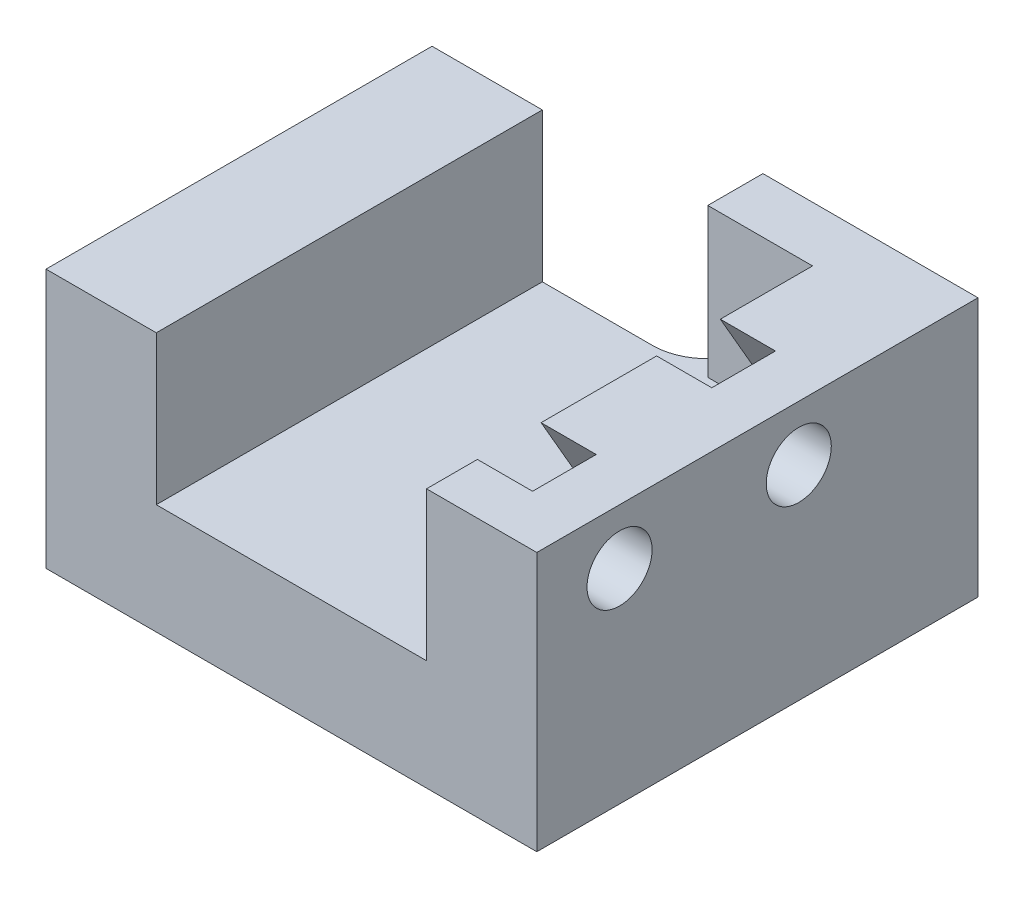
ISO-10303-21;
HEADER;
FILE_DESCRIPTION(('STEP AP214'),'2;1');
FILE_NAME('part.step','',(''),(''),'','','');
FILE_SCHEMA(('AUTOMOTIVE_DESIGN { 1 0 10303 214 1 1 1 1 }'));
ENDSEC;
DATA;
#1=APPLICATION_CONTEXT('core data for automotive mechanical design processes');
#2=APPLICATION_PROTOCOL_DEFINITION('international standard','automotive_design',2000,#1);
#3=PRODUCT_CONTEXT('',#1,'mechanical');
#4=PRODUCT('Part','Part','',(#3));
#5=PRODUCT_RELATED_PRODUCT_CATEGORY('part','',(#4));
#6=PRODUCT_DEFINITION_FORMATION('','',#4);
#7=PRODUCT_DEFINITION_CONTEXT('part definition',#1,'design');
#8=PRODUCT_DEFINITION('design','',#6,#7);
#9=PRODUCT_DEFINITION_SHAPE('','',#8);
#10=(LENGTH_UNIT() NAMED_UNIT(*) SI_UNIT(.MILLI.,.METRE.));
#11=(NAMED_UNIT(*) PLANE_ANGLE_UNIT() SI_UNIT($,.RADIAN.));
#12=(NAMED_UNIT(*) SI_UNIT($,.STERADIAN.) SOLID_ANGLE_UNIT());
#13=UNCERTAINTY_MEASURE_WITH_UNIT(LENGTH_MEASURE(1.E-05),#10,'distance_accuracy_value','');
#14=(GEOMETRIC_REPRESENTATION_CONTEXT(3) GLOBAL_UNCERTAINTY_ASSIGNED_CONTEXT((#13)) GLOBAL_UNIT_ASSIGNED_CONTEXT((#10,
#11,#12)) REPRESENTATION_CONTEXT('',''));
#15=CARTESIAN_POINT('',(0.,0.,0.));
#16=DIRECTION('',(0.,0.,1.));
#17=DIRECTION('',(1.,0.,0.));
#18=AXIS2_PLACEMENT_3D('',#15,#16,#17);
#19=CARTESIAN_POINT('',(2.075,2.,-3.5));
#20=DIRECTION('',(0.,0.,1.));
#21=DIRECTION('',(1.,0.,0.));
#22=AXIS2_PLACEMENT_3D('',#19,#20,#21);
#23=PLANE('',#22);
#24=DIRECTION('',(-1.,0.,0.));
#25=VECTOR('',#24,1.);
#26=CARTESIAN_POINT('',(-2.075,2.,-3.5));
#27=LINE('',#26,#25);
#28=CARTESIAN_POINT('',(-0.0750000000000013,2.,-3.5));
#29=VERTEX_POINT('',#28);
#30=CARTESIAN_POINT('',(-2.075,2.,-3.5));
#31=VERTEX_POINT('',#30);
#32=EDGE_CURVE('E377',#29,#31,#27,.T.);
#33=ORIENTED_EDGE('',*,*,#32,.F.);
#34=DIRECTION('',(0.,1.,0.));
#35=VECTOR('',#34,1.);
#36=CARTESIAN_POINT('',(-0.0750000000000014,0.,-3.5));
#37=LINE('',#36,#35);
#38=CARTESIAN_POINT('',(-0.0750000000000004,0.,-3.5));
#39=VERTEX_POINT('',#38);
#40=EDGE_CURVE('E60',#29,#39,#37,.F.);
#41=ORIENTED_EDGE('',*,*,#40,.T.);
#42=DIRECTION('',(-1.,0.,0.));
#43=VECTOR('',#42,1.);
#44=CARTESIAN_POINT('',(2.075,0.,-3.5));
#45=LINE('',#44,#43);
#46=CARTESIAN_POINT('',(-4.075,0.,-3.5));
#47=VERTEX_POINT('',#46);
#48=EDGE_CURVE('E204',#39,#47,#45,.T.);
#49=ORIENTED_EDGE('',*,*,#48,.T.);
#50=DIRECTION('',(0.,-1.,0.));
#51=VECTOR('',#50,1.);
#52=CARTESIAN_POINT('',(-4.075,2.,-3.5));
#53=LINE('',#52,#51);
#54=CARTESIAN_POINT('',(-4.075,4.7,-3.5));
#55=VERTEX_POINT('',#54);
#56=EDGE_CURVE('E387',#55,#47,#53,.T.);
#57=ORIENTED_EDGE('',*,*,#56,.F.);
#58=DIRECTION('',(-1.,0.,0.));
#59=VECTOR('',#58,1.);
#60=CARTESIAN_POINT('',(-4.075,4.7,-3.5));
#61=LINE('',#60,#59);
#62=CARTESIAN_POINT('',(-2.075,4.7,-3.5));
#63=VERTEX_POINT('',#62);
#64=EDGE_CURVE('E361',#63,#55,#61,.T.);
#65=ORIENTED_EDGE('',*,*,#64,.F.);
#66=DIRECTION('',(0.,-1.,0.));
#67=VECTOR('',#66,1.);
#68=CARTESIAN_POINT('',(-2.075,4.7,-3.5));
#69=LINE('',#68,#67);
#70=EDGE_CURVE('E364',#63,#31,#69,.T.);
#71=ORIENTED_EDGE('',*,*,#70,.T.);
#72=EDGE_LOOP('',(#33,#41,#49,#57,#65,#71));
#73=FACE_BOUND('',#72,.T.);
#74=ADVANCED_FACE('F39',(#73),#23,.F.);
#75=CARTESIAN_POINT('',(0.,2.,0.));
#76=DIRECTION('',(0.,1.,0.));
#77=DIRECTION('',(0.,0.,1.));
#78=AXIS2_PLACEMENT_3D('',#75,#76,#77);
#79=PLANE('',#78);
#80=DIRECTION('',(1.,0.,0.));
#81=VECTOR('',#80,1.);
#82=CARTESIAN_POINT('',(-4.075,2.,3.5));
#83=LINE('',#82,#81);
#84=CARTESIAN_POINT('',(-2.075,2.,3.5));
#85=VERTEX_POINT('',#84);
#86=CARTESIAN_POINT('',(2.825,2.,3.5));
#87=VERTEX_POINT('',#86);
#88=EDGE_CURVE('E376',#85,#87,#83,.T.);
#89=ORIENTED_EDGE('',*,*,#88,.T.);
#90=DIRECTION('',(0.,0.,1.));
#91=VECTOR('',#90,1.);
#92=CARTESIAN_POINT('',(2.825,2.,-3.5));
#93=LINE('',#92,#91);
#94=CARTESIAN_POINT('',(2.825,2.,-3.5));
#95=VERTEX_POINT('',#94);
#96=EDGE_CURVE('E341',#95,#87,#93,.T.);
#97=ORIENTED_EDGE('',*,*,#96,.F.);
#98=CARTESIAN_POINT('',(0.924999999999999,2.,-3.5));
#99=VERTEX_POINT('',#98);
#100=EDGE_CURVE('E373',#95,#99,#27,.T.);
#101=ORIENTED_EDGE('',*,*,#100,.T.);
#102=DIRECTION('',(0.,0.,1.));
#103=VECTOR('',#102,1.);
#104=CARTESIAN_POINT('',(0.924999999999999,2.,-4.5));
#105=LINE('',#104,#103);
#106=CARTESIAN_POINT('',(0.924999999999999,2.,-4.5));
#107=VERTEX_POINT('',#106);
#108=EDGE_CURVE('E390',#107,#99,#105,.T.);
#109=ORIENTED_EDGE('',*,*,#108,.F.);
#110=CARTESIAN_POINT('',(-0.0750000000000012,2.,-4.5));
#111=DIRECTION('',(0.,1.,0.));
#112=DIRECTION('',(0.,0.,1.));
#113=AXIS2_PLACEMENT_3D('',#110,#111,#112);
#114=CIRCLE('',#113,1.);
#115=EDGE_CURVE('E47',#107,#29,#114,.F.);
#116=ORIENTED_EDGE('',*,*,#115,.T.);
#117=ORIENTED_EDGE('',*,*,#32,.T.);
#118=DIRECTION('',(0.,0.,-1.));
#119=VECTOR('',#118,1.);
#120=CARTESIAN_POINT('',(-2.075,2.,-3.5));
#121=LINE('',#120,#119);
#122=EDGE_CURVE('E344',#85,#31,#121,.T.);
#123=ORIENTED_EDGE('',*,*,#122,.F.);
#124=EDGE_LOOP('',(#89,#97,#101,#109,#116,#117,#123));
#125=FACE_BOUND('',#124,.T.);
#126=ADVANCED_FACE('F398',(#125),#79,.T.);
#127=CARTESIAN_POINT('',(-4.075,2.,-3.5));
#128=DIRECTION('',(1.,0.,0.));
#129=DIRECTION('',(0.,0.,-1.));
#130=AXIS2_PLACEMENT_3D('',#127,#128,#129);
#131=PLANE('',#130);
#132=DIRECTION('',(0.,0.,1.));
#133=VECTOR('',#132,1.);
#134=CARTESIAN_POINT('',(-4.075,0.,-3.5));
#135=LINE('',#134,#133);
#136=CARTESIAN_POINT('',(-4.075,0.,3.5));
#137=VERTEX_POINT('',#136);
#138=EDGE_CURVE('E372',#47,#137,#135,.T.);
#139=ORIENTED_EDGE('',*,*,#138,.T.);
#140=DIRECTION('',(0.,-1.,0.));
#141=VECTOR('',#140,1.);
#142=CARTESIAN_POINT('',(-4.075,2.,3.5));
#143=LINE('',#142,#141);
#144=CARTESIAN_POINT('',(-4.075,4.7,3.5));
#145=VERTEX_POINT('',#144);
#146=EDGE_CURVE('E384',#145,#137,#143,.T.);
#147=ORIENTED_EDGE('',*,*,#146,.F.);
#148=DIRECTION('',(0.,0.,1.));
#149=VECTOR('',#148,1.);
#150=CARTESIAN_POINT('',(-4.075,4.7,-3.5));
#151=LINE('',#150,#149);
#152=EDGE_CURVE('E354',#55,#145,#151,.T.);
#153=ORIENTED_EDGE('',*,*,#152,.F.);
#154=ORIENTED_EDGE('',*,*,#56,.T.);
#155=EDGE_LOOP('',(#139,#147,#153,#154));
#156=FACE_BOUND('',#155,.T.);
#157=ADVANCED_FACE('F470',(#156),#131,.F.);
#158=CARTESIAN_POINT('',(4.825,2.,3.5));
#159=DIRECTION('',(0.,0.,-1.));
#160=DIRECTION('',(-1.,0.,0.));
#161=AXIS2_PLACEMENT_3D('',#158,#159,#160);
#162=PLANE('',#161);
#163=DIRECTION('',(1.,0.,0.));
#164=VECTOR('',#163,1.);
#165=CARTESIAN_POINT('',(4.825,0.,3.5));
#166=LINE('',#165,#164);
#167=CARTESIAN_POINT('',(4.825,0.,3.5));
#168=VERTEX_POINT('',#167);
#169=EDGE_CURVE('E205',#137,#168,#166,.T.);
#170=ORIENTED_EDGE('',*,*,#169,.T.);
#171=DIRECTION('',(0.,-1.,0.));
#172=VECTOR('',#171,1.);
#173=CARTESIAN_POINT('',(4.825,2.,3.5));
#174=LINE('',#173,#172);
#175=CARTESIAN_POINT('',(4.825,4.7,3.5));
#176=VERTEX_POINT('',#175);
#177=EDGE_CURVE('E202',#176,#168,#174,.T.);
#178=ORIENTED_EDGE('',*,*,#177,.F.);
#179=DIRECTION('',(1.,0.,0.));
#180=VECTOR('',#179,1.);
#181=CARTESIAN_POINT('',(2.825,4.7,3.5));
#182=LINE('',#181,#180);
#183=CARTESIAN_POINT('',(2.825,4.7,3.5));
#184=VERTEX_POINT('',#183);
#185=EDGE_CURVE('E347',#184,#176,#182,.T.);
#186=ORIENTED_EDGE('',*,*,#185,.F.);
#187=DIRECTION('',(0.,-1.,0.));
#188=VECTOR('',#187,1.);
#189=CARTESIAN_POINT('',(2.825,4.7,3.5));
#190=LINE('',#189,#188);
#191=EDGE_CURVE('E282',#184,#87,#190,.T.);
#192=ORIENTED_EDGE('',*,*,#191,.T.);
#193=ORIENTED_EDGE('',*,*,#88,.F.);
#194=DIRECTION('',(0.,-1.,0.));
#195=VECTOR('',#194,1.);
#196=CARTESIAN_POINT('',(-2.075,4.7,3.5));
#197=LINE('',#196,#195);
#198=CARTESIAN_POINT('',(-2.075,4.7,3.5));
#199=VERTEX_POINT('',#198);
#200=EDGE_CURVE('E369',#199,#85,#197,.T.);
#201=ORIENTED_EDGE('',*,*,#200,.F.);
#202=DIRECTION('',(1.,0.,0.));
#203=VECTOR('',#202,1.);
#204=CARTESIAN_POINT('',(-4.075,4.7,3.5));
#205=LINE('',#204,#203);
#206=EDGE_CURVE('E357',#145,#199,#205,.T.);
#207=ORIENTED_EDGE('',*,*,#206,.F.);
#208=ORIENTED_EDGE('',*,*,#146,.T.);
#209=EDGE_LOOP('',(#170,#178,#186,#192,#193,#201,#207,#208));
#210=FACE_BOUND('',#209,.T.);
#211=ADVANCED_FACE('F410',(#210),#162,.F.);
#212=CARTESIAN_POINT('',(4.825,2.,-3.5));
#213=DIRECTION('',(-1.,0.,0.));
#214=DIRECTION('',(0.,0.,1.));
#215=AXIS2_PLACEMENT_3D('',#212,#213,#214);
#216=PLANE('',#215);
#217=CARTESIAN_POINT('',(4.825,3.7,2.));
#218=DIRECTION('',(1.,0.,0.));
#219=DIRECTION('',(0.,0.,-1.));
#220=AXIS2_PLACEMENT_3D('',#217,#218,#219);
#221=CIRCLE('',#220,0.59);
#222=CARTESIAN_POINT('',(4.825,3.7,1.41));
#223=VERTEX_POINT('',#222);
#224=EDGE_CURVE('E239',#223,#223,#221,.T.);
#225=ORIENTED_EDGE('',*,*,#224,.F.);
#226=EDGE_LOOP('',(#225));
#227=FACE_BOUND('',#226,.T.);
#228=CARTESIAN_POINT('',(4.825,3.7,-1.25));
#229=DIRECTION('',(1.,0.,0.));
#230=DIRECTION('',(0.,0.,-1.));
#231=AXIS2_PLACEMENT_3D('',#228,#229,#230);
#232=CIRCLE('',#231,0.59);
#233=CARTESIAN_POINT('',(4.825,3.7,-1.84));
#234=VERTEX_POINT('',#233);
#235=EDGE_CURVE('E242',#234,#234,#232,.T.);
#236=ORIENTED_EDGE('',*,*,#235,.F.);
#237=EDGE_LOOP('',(#236));
#238=FACE_BOUND('',#237,.T.);
#239=DIRECTION('',(0.,0.,-1.));
#240=VECTOR('',#239,1.);
#241=CARTESIAN_POINT('',(4.825,0.,-3.5));
#242=LINE('',#241,#240);
#243=CARTESIAN_POINT('',(4.825,0.,-4.5));
#244=VERTEX_POINT('',#243);
#245=EDGE_CURVE('E196',#168,#244,#242,.T.);
#246=ORIENTED_EDGE('',*,*,#245,.T.);
#247=DIRECTION('',(0.,-1.,0.));
#248=VECTOR('',#247,1.);
#249=CARTESIAN_POINT('',(4.825,4.7,-4.5));
#250=LINE('',#249,#248);
#251=CARTESIAN_POINT('',(4.825,4.7,-4.5));
#252=VERTEX_POINT('',#251);
#253=EDGE_CURVE('E201',#252,#244,#250,.T.);
#254=ORIENTED_EDGE('',*,*,#253,.F.);
#255=DIRECTION('',(0.,0.,-1.));
#256=VECTOR('',#255,1.);
#257=CARTESIAN_POINT('',(4.825,4.7,-3.5));
#258=LINE('',#257,#256);
#259=EDGE_CURVE('E340',#176,#252,#258,.T.);
#260=ORIENTED_EDGE('',*,*,#259,.F.);
#261=ORIENTED_EDGE('',*,*,#177,.T.);
#262=EDGE_LOOP('',(#246,#254,#260,#261));
#263=FACE_BOUND('',#262,.T.);
#264=ADVANCED_FACE('F198',(#227,#238,#263),#216,.F.);
#265=CARTESIAN_POINT('',(0.,0.,0.));
#266=DIRECTION('',(0.,1.,0.));
#267=DIRECTION('',(0.,0.,1.));
#268=AXIS2_PLACEMENT_3D('',#265,#266,#267);
#269=PLANE('',#268);
#270=ORIENTED_EDGE('',*,*,#138,.F.);
#271=ORIENTED_EDGE('',*,*,#48,.F.);
#272=CARTESIAN_POINT('',(-0.0750000000000015,0.,-4.5));
#273=DIRECTION('',(0.,1.,0.));
#274=DIRECTION('',(0.,0.,1.));
#275=AXIS2_PLACEMENT_3D('',#272,#273,#274);
#276=CIRCLE('',#275,1.);
#277=CARTESIAN_POINT('',(0.924999999999998,0.,-4.5));
#278=VERTEX_POINT('',#277);
#279=EDGE_CURVE('E11',#39,#278,#276,.T.);
#280=ORIENTED_EDGE('',*,*,#279,.T.);
#281=DIRECTION('',(-1.,0.,0.));
#282=VECTOR('',#281,1.);
#283=CARTESIAN_POINT('',(4.825,0.,-4.5));
#284=LINE('',#283,#282);
#285=EDGE_CURVE('E208',#244,#278,#284,.T.);
#286=ORIENTED_EDGE('',*,*,#285,.F.);
#287=ORIENTED_EDGE('',*,*,#245,.F.);
#288=ORIENTED_EDGE('',*,*,#169,.F.);
#289=EDGE_LOOP('',(#270,#271,#280,#286,#287,#288));
#290=FACE_BOUND('',#289,.T.);
#291=ADVANCED_FACE('F210',(#290),#269,.F.);
#292=CARTESIAN_POINT('',(-2.075,4.7,-3.5));
#293=DIRECTION('',(-1.,0.,0.));
#294=DIRECTION('',(0.,0.,1.));
#295=AXIS2_PLACEMENT_3D('',#292,#293,#294);
#296=PLANE('',#295);
#297=ORIENTED_EDGE('',*,*,#122,.T.);
#298=ORIENTED_EDGE('',*,*,#70,.F.);
#299=DIRECTION('',(0.,0.,-1.));
#300=VECTOR('',#299,1.);
#301=CARTESIAN_POINT('',(-2.075,4.7,-3.5));
#302=LINE('',#301,#300);
#303=EDGE_CURVE('E359',#199,#63,#302,.T.);
#304=ORIENTED_EDGE('',*,*,#303,.F.);
#305=ORIENTED_EDGE('',*,*,#200,.T.);
#306=EDGE_LOOP('',(#297,#298,#304,#305));
#307=FACE_BOUND('',#306,.T.);
#308=ADVANCED_FACE('F546',(#307),#296,.F.);
#309=CARTESIAN_POINT('',(0.,4.7,0.));
#310=DIRECTION('',(0.,1.,0.));
#311=DIRECTION('',(0.,0.,1.));
#312=AXIS2_PLACEMENT_3D('',#309,#310,#311);
#313=PLANE('',#312);
#314=ORIENTED_EDGE('',*,*,#152,.T.);
#315=ORIENTED_EDGE('',*,*,#206,.T.);
#316=ORIENTED_EDGE('',*,*,#303,.T.);
#317=ORIENTED_EDGE('',*,*,#64,.T.);
#318=EDGE_LOOP('',(#314,#315,#316,#317));
#319=FACE_BOUND('',#318,.T.);
#320=ADVANCED_FACE('F487',(#319),#313,.T.);
#321=CARTESIAN_POINT('',(2.825,4.7,-3.5));
#322=DIRECTION('',(1.,0.,0.));
#323=DIRECTION('',(0.,0.,-1.));
#324=AXIS2_PLACEMENT_3D('',#321,#322,#323);
#325=PLANE('',#324);
#326=DIRECTION('',(0.,-0.866025403784439,0.5));
#327=VECTOR('',#326,1.);
#328=CARTESIAN_POINT('',(2.825,3.7,-2.40470053837925));
#329=LINE('',#328,#327);
#330=CARTESIAN_POINT('',(2.825,3.7,-2.40470053837925));
#331=VERTEX_POINT('',#330);
#332=CARTESIAN_POINT('',(2.825,2.7,-1.82735026918963));
#333=VERTEX_POINT('',#332);
#334=EDGE_CURVE('E275',#331,#333,#329,.T.);
#335=ORIENTED_EDGE('',*,*,#334,.F.);
#336=DIRECTION('',(0.,-0.866025403784439,-0.5));
#337=VECTOR('',#336,1.);
#338=CARTESIAN_POINT('',(2.825,4.7,-1.82735026918963));
#339=LINE('',#338,#337);
#340=CARTESIAN_POINT('',(2.825,4.7,-1.82735026918963));
#341=VERTEX_POINT('',#340);
#342=EDGE_CURVE('E272',#341,#331,#339,.T.);
#343=ORIENTED_EDGE('',*,*,#342,.F.);
#344=DIRECTION('',(0.,0.,1.));
#345=VECTOR('',#344,1.);
#346=CARTESIAN_POINT('',(2.825,4.7,-3.5));
#347=LINE('',#346,#345);
#348=CARTESIAN_POINT('',(2.825,4.7,-3.5));
#349=VERTEX_POINT('',#348);
#350=EDGE_CURVE('E345',#349,#341,#347,.T.);
#351=ORIENTED_EDGE('',*,*,#350,.F.);
#352=DIRECTION('',(0.,-1.,0.));
#353=VECTOR('',#352,1.);
#354=CARTESIAN_POINT('',(2.825,4.7,-3.5));
#355=LINE('',#354,#353);
#356=EDGE_CURVE('E337',#349,#95,#355,.T.);
#357=ORIENTED_EDGE('',*,*,#356,.T.);
#358=ORIENTED_EDGE('',*,*,#96,.T.);
#359=ORIENTED_EDGE('',*,*,#191,.F.);
#360=CARTESIAN_POINT('',(2.825,4.7,2.57735026918963));
#361=VERTEX_POINT('',#360);
#362=EDGE_CURVE('E350',#361,#184,#347,.T.);
#363=ORIENTED_EDGE('',*,*,#362,.F.);
#364=DIRECTION('',(0.,0.866025403784439,-0.499999999999999));
#365=VECTOR('',#364,1.);
#366=CARTESIAN_POINT('',(2.825,3.7,3.15470053837925));
#367=LINE('',#366,#365);
#368=CARTESIAN_POINT('',(2.825,3.7,3.15470053837925));
#369=VERTEX_POINT('',#368);
#370=EDGE_CURVE('E316',#369,#361,#367,.T.);
#371=ORIENTED_EDGE('',*,*,#370,.F.);
#372=DIRECTION('',(0.,0.866025403784439,0.5));
#373=VECTOR('',#372,1.);
#374=CARTESIAN_POINT('',(2.825,2.7,2.57735026918963));
#375=LINE('',#374,#373);
#376=CARTESIAN_POINT('',(2.825,2.7,2.57735026918963));
#377=VERTEX_POINT('',#376);
#378=EDGE_CURVE('E270',#377,#369,#375,.T.);
#379=ORIENTED_EDGE('',*,*,#378,.F.);
#380=DIRECTION('',(0.,0.,1.));
#381=VECTOR('',#380,1.);
#382=CARTESIAN_POINT('',(2.825,2.7,1.42264973081037));
#383=LINE('',#382,#381);
#384=CARTESIAN_POINT('',(2.825,2.7,1.42264973081037));
#385=VERTEX_POINT('',#384);
#386=EDGE_CURVE('E306',#385,#377,#383,.T.);
#387=ORIENTED_EDGE('',*,*,#386,.F.);
#388=DIRECTION('',(0.,-0.866025403784439,0.5));
#389=VECTOR('',#388,1.);
#390=CARTESIAN_POINT('',(2.825,3.7,0.845299461620749));
#391=LINE('',#390,#389);
#392=CARTESIAN_POINT('',(2.825,3.7,0.845299461620749));
#393=VERTEX_POINT('',#392);
#394=EDGE_CURVE('E309',#393,#385,#391,.T.);
#395=ORIENTED_EDGE('',*,*,#394,.F.);
#396=DIRECTION('',(0.,-0.866025403784439,-0.5));
#397=VECTOR('',#396,1.);
#398=CARTESIAN_POINT('',(2.825,4.7,1.42264973081037));
#399=LINE('',#398,#397);
#400=CARTESIAN_POINT('',(2.825,4.7,1.42264973081037));
#401=VERTEX_POINT('',#400);
#402=EDGE_CURVE('E313',#401,#393,#399,.T.);
#403=ORIENTED_EDGE('',*,*,#402,.F.);
#404=CARTESIAN_POINT('',(2.825,4.7,-0.672649730810375));
#405=VERTEX_POINT('',#404);
#406=EDGE_CURVE('E353',#405,#401,#347,.T.);
#407=ORIENTED_EDGE('',*,*,#406,.F.);
#408=DIRECTION('',(0.,0.866025403784439,-0.5));
#409=VECTOR('',#408,1.);
#410=CARTESIAN_POINT('',(2.825,3.7,-0.095299461620748));
#411=LINE('',#410,#409);
#412=CARTESIAN_POINT('',(2.825,3.7,-0.095299461620748));
#413=VERTEX_POINT('',#412);
#414=EDGE_CURVE('E269',#413,#405,#411,.T.);
#415=ORIENTED_EDGE('',*,*,#414,.F.);
#416=DIRECTION('',(0.,0.866025403784439,0.5));
#417=VECTOR('',#416,1.);
#418=CARTESIAN_POINT('',(2.825,2.7,-0.672649730810375));
#419=LINE('',#418,#417);
#420=CARTESIAN_POINT('',(2.825,2.7,-0.672649730810375));
#421=VERTEX_POINT('',#420);
#422=EDGE_CURVE('E266',#421,#413,#419,.T.);
#423=ORIENTED_EDGE('',*,*,#422,.F.);
#424=DIRECTION('',(0.,0.,1.));
#425=VECTOR('',#424,1.);
#426=CARTESIAN_POINT('',(2.825,2.7,-1.82735026918963));
#427=LINE('',#426,#425);
#428=EDGE_CURVE('E251',#333,#421,#427,.T.);
#429=ORIENTED_EDGE('',*,*,#428,.F.);
#430=EDGE_LOOP('',(#335,#343,#351,#357,#358,#359,#363,#371,#379,#387,#395,#403,#407,#415,#423,#429));
#431=FACE_BOUND('',#430,.T.);
#432=ADVANCED_FACE('F414',(#431),#325,.F.);
#433=CARTESIAN_POINT('',(0.,4.7,0.));
#434=DIRECTION('',(0.,1.,0.));
#435=DIRECTION('',(0.,0.,1.));
#436=AXIS2_PLACEMENT_3D('',#433,#434,#435);
#437=PLANE('',#436);
#438=DIRECTION('',(-1.,0.,0.));
#439=VECTOR('',#438,1.);
#440=CARTESIAN_POINT('',(3.825,4.7,-1.82735026918963));
#441=LINE('',#440,#439);
#442=CARTESIAN_POINT('',(3.825,4.7,-1.82735026918963));
#443=VERTEX_POINT('',#442);
#444=EDGE_CURVE('E287',#443,#341,#441,.T.);
#445=ORIENTED_EDGE('',*,*,#444,.F.);
#446=DIRECTION('',(0.,0.,-1.));
#447=VECTOR('',#446,1.);
#448=CARTESIAN_POINT('',(3.825,4.7,-0.672649730810375));
#449=LINE('',#448,#447);
#450=CARTESIAN_POINT('',(3.825,4.7,-0.672649730810375));
#451=VERTEX_POINT('',#450);
#452=EDGE_CURVE('E253',#451,#443,#449,.T.);
#453=ORIENTED_EDGE('',*,*,#452,.F.);
#454=DIRECTION('',(-1.,0.,0.));
#455=VECTOR('',#454,1.);
#456=CARTESIAN_POINT('',(3.825,4.7,-0.672649730810375));
#457=LINE('',#456,#455);
#458=EDGE_CURVE('E289',#451,#405,#457,.T.);
#459=ORIENTED_EDGE('',*,*,#458,.T.);
#460=ORIENTED_EDGE('',*,*,#406,.T.);
#461=DIRECTION('',(-1.,0.,0.));
#462=VECTOR('',#461,1.);
#463=CARTESIAN_POINT('',(3.825,4.7,1.42264973081037));
#464=LINE('',#463,#462);
#465=CARTESIAN_POINT('',(3.825,4.7,1.42264973081037));
#466=VERTEX_POINT('',#465);
#467=EDGE_CURVE('E299',#466,#401,#464,.T.);
#468=ORIENTED_EDGE('',*,*,#467,.F.);
#469=DIRECTION('',(0.,0.,-1.));
#470=VECTOR('',#469,1.);
#471=CARTESIAN_POINT('',(3.825,4.7,2.57735026918963));
#472=LINE('',#471,#470);
#473=CARTESIAN_POINT('',(3.825,4.7,2.57735026918963));
#474=VERTEX_POINT('',#473);
#475=EDGE_CURVE('E328',#474,#466,#472,.T.);
#476=ORIENTED_EDGE('',*,*,#475,.F.);
#477=DIRECTION('',(-1.,0.,0.));
#478=VECTOR('',#477,1.);
#479=CARTESIAN_POINT('',(3.825,4.7,2.57735026918963));
#480=LINE('',#479,#478);
#481=EDGE_CURVE('E296',#474,#361,#480,.T.);
#482=ORIENTED_EDGE('',*,*,#481,.T.);
#483=ORIENTED_EDGE('',*,*,#362,.T.);
#484=ORIENTED_EDGE('',*,*,#185,.T.);
#485=ORIENTED_EDGE('',*,*,#259,.T.);
#486=DIRECTION('',(1.,0.,0.));
#487=VECTOR('',#486,1.);
#488=CARTESIAN_POINT('',(4.825,4.7,-4.5));
#489=LINE('',#488,#487);
#490=CARTESIAN_POINT('',(0.924999999999999,4.7,-4.5));
#491=VERTEX_POINT('',#490);
#492=EDGE_CURVE('E220',#491,#252,#489,.T.);
#493=ORIENTED_EDGE('',*,*,#492,.F.);
#494=DIRECTION('',(0.,0.,1.));
#495=VECTOR('',#494,1.);
#496=CARTESIAN_POINT('',(0.924999999999999,4.7,-4.5));
#497=LINE('',#496,#495);
#498=CARTESIAN_POINT('',(0.924999999999999,4.7,-3.5));
#499=VERTEX_POINT('',#498);
#500=EDGE_CURVE('E230',#491,#499,#497,.T.);
#501=ORIENTED_EDGE('',*,*,#500,.T.);
#502=DIRECTION('',(1.,0.,0.));
#503=VECTOR('',#502,1.);
#504=CARTESIAN_POINT('',(4.825,4.7,-3.5));
#505=LINE('',#504,#503);
#506=EDGE_CURVE('E221',#499,#349,#505,.T.);
#507=ORIENTED_EDGE('',*,*,#506,.T.);
#508=ORIENTED_EDGE('',*,*,#350,.T.);
#509=EDGE_LOOP('',(#445,#453,#459,#460,#468,#476,#482,#483,#484,#485,#493,#501,#507,#508));
#510=FACE_BOUND('',#509,.T.);
#511=ADVANCED_FACE('F405',(#510),#437,.T.);
#512=CARTESIAN_POINT('',(3.825,2.7,2.57735026918963));
#513=DIRECTION('',(0.,-0.5,0.866025403784439));
#514=DIRECTION('',(0.,-0.866025403784439,-0.5));
#515=AXIS2_PLACEMENT_3D('',#512,#513,#514);
#516=PLANE('',#515);
#517=ORIENTED_EDGE('',*,*,#378,.T.);
#518=DIRECTION('',(-1.,0.,0.));
#519=VECTOR('',#518,1.);
#520=CARTESIAN_POINT('',(3.825,3.7,3.15470053837925));
#521=LINE('',#520,#519);
#522=CARTESIAN_POINT('',(3.825,3.7,3.15470053837925));
#523=VERTEX_POINT('',#522);
#524=EDGE_CURVE('E293',#523,#369,#521,.T.);
#525=ORIENTED_EDGE('',*,*,#524,.F.);
#526=DIRECTION('',(0.,0.866025403784439,0.5));
#527=VECTOR('',#526,1.);
#528=CARTESIAN_POINT('',(3.825,2.7,2.57735026918963));
#529=LINE('',#528,#527);
#530=CARTESIAN_POINT('',(3.825,2.7,2.57735026918963));
#531=VERTEX_POINT('',#530);
#532=EDGE_CURVE('E310',#531,#523,#529,.T.);
#533=ORIENTED_EDGE('',*,*,#532,.F.);
#534=DIRECTION('',(-1.,0.,0.));
#535=VECTOR('',#534,1.);
#536=CARTESIAN_POINT('',(3.825,2.7,2.57735026918963));
#537=LINE('',#536,#535);
#538=EDGE_CURVE('E238',#531,#377,#537,.T.);
#539=ORIENTED_EDGE('',*,*,#538,.T.);
#540=EDGE_LOOP('',(#517,#525,#533,#539));
#541=FACE_BOUND('',#540,.T.);
#542=ADVANCED_FACE('F450',(#541),#516,.F.);
#543=CARTESIAN_POINT('',(3.825,2.7,1.42264973081037));
#544=DIRECTION('',(0.,-1.,0.));
#545=DIRECTION('',(0.,0.,-1.));
#546=AXIS2_PLACEMENT_3D('',#543,#544,#545);
#547=PLANE('',#546);
#548=ORIENTED_EDGE('',*,*,#386,.T.);
#549=ORIENTED_EDGE('',*,*,#538,.F.);
#550=DIRECTION('',(0.,0.,1.));
#551=VECTOR('',#550,1.);
#552=CARTESIAN_POINT('',(3.825,2.7,1.42264973081037));
#553=LINE('',#552,#551);
#554=CARTESIAN_POINT('',(3.825,2.7,1.42264973081037));
#555=VERTEX_POINT('',#554);
#556=EDGE_CURVE('E295',#555,#531,#553,.T.);
#557=ORIENTED_EDGE('',*,*,#556,.F.);
#558=DIRECTION('',(-1.,0.,0.));
#559=VECTOR('',#558,1.);
#560=CARTESIAN_POINT('',(3.825,2.7,1.42264973081037));
#561=LINE('',#560,#559);
#562=EDGE_CURVE('E303',#555,#385,#561,.T.);
#563=ORIENTED_EDGE('',*,*,#562,.T.);
#564=EDGE_LOOP('',(#548,#549,#557,#563));
#565=FACE_BOUND('',#564,.T.);
#566=ADVANCED_FACE('F453',(#565),#547,.F.);
#567=CARTESIAN_POINT('',(3.825,3.7,0.845299461620749));
#568=DIRECTION('',(0.,-0.5,-0.866025403784439));
#569=DIRECTION('',(0.,0.866025403784439,-0.5));
#570=AXIS2_PLACEMENT_3D('',#567,#568,#569);
#571=PLANE('',#570);
#572=ORIENTED_EDGE('',*,*,#394,.T.);
#573=ORIENTED_EDGE('',*,*,#562,.F.);
#574=DIRECTION('',(0.,-0.866025403784439,0.5));
#575=VECTOR('',#574,1.);
#576=CARTESIAN_POINT('',(3.825,3.7,0.845299461620749));
#577=LINE('',#576,#575);
#578=CARTESIAN_POINT('',(3.825,3.7,0.845299461620749));
#579=VERTEX_POINT('',#578);
#580=EDGE_CURVE('E322',#579,#555,#577,.T.);
#581=ORIENTED_EDGE('',*,*,#580,.F.);
#582=DIRECTION('',(-1.,0.,0.));
#583=VECTOR('',#582,1.);
#584=CARTESIAN_POINT('',(3.825,3.7,0.845299461620749));
#585=LINE('',#584,#583);
#586=EDGE_CURVE('E301',#579,#393,#585,.T.);
#587=ORIENTED_EDGE('',*,*,#586,.T.);
#588=EDGE_LOOP('',(#572,#573,#581,#587));
#589=FACE_BOUND('',#588,.T.);
#590=ADVANCED_FACE('F455',(#589),#571,.F.);
#591=CARTESIAN_POINT('',(3.825,4.7,1.42264973081037));
#592=DIRECTION('',(0.,0.5,-0.866025403784439));
#593=DIRECTION('',(0.,0.866025403784439,0.5));
#594=AXIS2_PLACEMENT_3D('',#591,#592,#593);
#595=PLANE('',#594);
#596=ORIENTED_EDGE('',*,*,#402,.T.);
#597=ORIENTED_EDGE('',*,*,#586,.F.);
#598=DIRECTION('',(0.,-0.866025403784439,-0.5));
#599=VECTOR('',#598,1.);
#600=CARTESIAN_POINT('',(3.825,4.7,1.42264973081037));
#601=LINE('',#600,#599);
#602=EDGE_CURVE('E325',#466,#579,#601,.T.);
#603=ORIENTED_EDGE('',*,*,#602,.F.);
#604=ORIENTED_EDGE('',*,*,#467,.T.);
#605=EDGE_LOOP('',(#596,#597,#603,#604));
#606=FACE_BOUND('',#605,.T.);
#607=ADVANCED_FACE('F438',(#606),#595,.F.);
#608=CARTESIAN_POINT('',(3.825,3.7,3.15470053837925));
#609=DIRECTION('',(0.,0.499999999999999,0.866025403784439));
#610=DIRECTION('',(0.,-0.866025403784439,0.499999999999999));
#611=AXIS2_PLACEMENT_3D('',#608,#609,#610);
#612=PLANE('',#611);
#613=ORIENTED_EDGE('',*,*,#370,.T.);
#614=ORIENTED_EDGE('',*,*,#481,.F.);
#615=DIRECTION('',(0.,0.866025403784439,-0.499999999999999));
#616=VECTOR('',#615,1.);
#617=CARTESIAN_POINT('',(3.825,3.7,3.15470053837925));
#618=LINE('',#617,#616);
#619=EDGE_CURVE('E331',#523,#474,#618,.T.);
#620=ORIENTED_EDGE('',*,*,#619,.F.);
#621=ORIENTED_EDGE('',*,*,#524,.T.);
#622=EDGE_LOOP('',(#613,#614,#620,#621));
#623=FACE_BOUND('',#622,.T.);
#624=ADVANCED_FACE('F446',(#623),#612,.F.);
#625=CARTESIAN_POINT('',(3.825,0.,0.));
#626=DIRECTION('',(-1.,0.,0.));
#627=DIRECTION('',(0.,0.,1.));
#628=AXIS2_PLACEMENT_3D('',#625,#626,#627);
#629=PLANE('',#628);
#630=CARTESIAN_POINT('',(3.825,3.7,2.));
#631=DIRECTION('',(-1.,0.,0.));
#632=DIRECTION('',(0.,0.,1.));
#633=AXIS2_PLACEMENT_3D('',#630,#631,#632);
#634=CIRCLE('',#633,0.59);
#635=CARTESIAN_POINT('',(3.825,3.7,2.59));
#636=VERTEX_POINT('',#635);
#637=EDGE_CURVE('E235',#636,#636,#634,.F.);
#638=ORIENTED_EDGE('',*,*,#637,.T.);
#639=EDGE_LOOP('',(#638));
#640=FACE_BOUND('',#639,.T.);
#641=ORIENTED_EDGE('',*,*,#532,.T.);
#642=ORIENTED_EDGE('',*,*,#619,.T.);
#643=ORIENTED_EDGE('',*,*,#475,.T.);
#644=ORIENTED_EDGE('',*,*,#602,.T.);
#645=ORIENTED_EDGE('',*,*,#580,.T.);
#646=ORIENTED_EDGE('',*,*,#556,.T.);
#647=EDGE_LOOP('',(#641,#642,#643,#644,#645,#646));
#648=FACE_BOUND('',#647,.T.);
#649=ADVANCED_FACE('F441',(#640,#648),#629,.T.);
#650=CARTESIAN_POINT('',(3.825,2.7,-0.672649730810375));
#651=DIRECTION('',(0.,-0.5,0.866025403784439));
#652=DIRECTION('',(0.,-0.866025403784439,-0.5));
#653=AXIS2_PLACEMENT_3D('',#650,#651,#652);
#654=PLANE('',#653);
#655=ORIENTED_EDGE('',*,*,#422,.T.);
#656=DIRECTION('',(-1.,0.,0.));
#657=VECTOR('',#656,1.);
#658=CARTESIAN_POINT('',(3.825,3.7,-0.095299461620748));
#659=LINE('',#658,#657);
#660=CARTESIAN_POINT('',(3.825,3.7,-0.095299461620748));
#661=VERTEX_POINT('',#660);
#662=EDGE_CURVE('E265',#661,#413,#659,.T.);
#663=ORIENTED_EDGE('',*,*,#662,.F.);
#664=DIRECTION('',(0.,0.866025403784439,0.5));
#665=VECTOR('',#664,1.);
#666=CARTESIAN_POINT('',(3.825,2.7,-0.672649730810375));
#667=LINE('',#666,#665);
#668=CARTESIAN_POINT('',(3.825,2.7,-0.672649730810375));
#669=VERTEX_POINT('',#668);
#670=EDGE_CURVE('E247',#669,#661,#667,.T.);
#671=ORIENTED_EDGE('',*,*,#670,.F.);
#672=DIRECTION('',(-1.,0.,0.));
#673=VECTOR('',#672,1.);
#674=CARTESIAN_POINT('',(3.825,2.7,-0.672649730810375));
#675=LINE('',#674,#673);
#676=EDGE_CURVE('E280',#669,#421,#675,.T.);
#677=ORIENTED_EDGE('',*,*,#676,.T.);
#678=EDGE_LOOP('',(#655,#663,#671,#677));
#679=FACE_BOUND('',#678,.T.);
#680=ADVANCED_FACE('F518',(#679),#654,.F.);
#681=CARTESIAN_POINT('',(3.825,2.7,-1.82735026918963));
#682=DIRECTION('',(0.,-1.,0.));
#683=DIRECTION('',(0.,0.,-1.));
#684=AXIS2_PLACEMENT_3D('',#681,#682,#683);
#685=PLANE('',#684);
#686=ORIENTED_EDGE('',*,*,#428,.T.);
#687=ORIENTED_EDGE('',*,*,#676,.F.);
#688=DIRECTION('',(0.,0.,1.));
#689=VECTOR('',#688,1.);
#690=CARTESIAN_POINT('',(3.825,2.7,-1.82735026918963));
#691=LINE('',#690,#689);
#692=CARTESIAN_POINT('',(3.825,2.7,-1.82735026918963));
#693=VERTEX_POINT('',#692);
#694=EDGE_CURVE('E262',#693,#669,#691,.T.);
#695=ORIENTED_EDGE('',*,*,#694,.F.);
#696=DIRECTION('',(-1.,0.,0.));
#697=VECTOR('',#696,1.);
#698=CARTESIAN_POINT('',(3.825,2.7,-1.82735026918963));
#699=LINE('',#698,#697);
#700=EDGE_CURVE('E283',#693,#333,#699,.T.);
#701=ORIENTED_EDGE('',*,*,#700,.T.);
#702=EDGE_LOOP('',(#686,#687,#695,#701));
#703=FACE_BOUND('',#702,.T.);
#704=ADVANCED_FACE('F514',(#703),#685,.F.);
#705=CARTESIAN_POINT('',(3.825,3.7,-2.40470053837925));
#706=DIRECTION('',(0.,-0.5,-0.866025403784439));
#707=DIRECTION('',(0.,0.866025403784439,-0.5));
#708=AXIS2_PLACEMENT_3D('',#705,#706,#707);
#709=PLANE('',#708);
#710=ORIENTED_EDGE('',*,*,#334,.T.);
#711=ORIENTED_EDGE('',*,*,#700,.F.);
#712=DIRECTION('',(0.,-0.866025403784439,0.5));
#713=VECTOR('',#712,1.);
#714=CARTESIAN_POINT('',(3.825,3.7,-2.40470053837925));
#715=LINE('',#714,#713);
#716=CARTESIAN_POINT('',(3.825,3.7,-2.40470053837925));
#717=VERTEX_POINT('',#716);
#718=EDGE_CURVE('E259',#717,#693,#715,.T.);
#719=ORIENTED_EDGE('',*,*,#718,.F.);
#720=DIRECTION('',(-1.,0.,0.));
#721=VECTOR('',#720,1.);
#722=CARTESIAN_POINT('',(3.825,3.7,-2.40470053837925));
#723=LINE('',#722,#721);
#724=EDGE_CURVE('E285',#717,#331,#723,.T.);
#725=ORIENTED_EDGE('',*,*,#724,.T.);
#726=EDGE_LOOP('',(#710,#711,#719,#725));
#727=FACE_BOUND('',#726,.T.);
#728=ADVANCED_FACE('F517',(#727),#709,.F.);
#729=CARTESIAN_POINT('',(3.825,4.7,-1.82735026918963));
#730=DIRECTION('',(0.,0.5,-0.866025403784439));
#731=DIRECTION('',(0.,0.866025403784439,0.5));
#732=AXIS2_PLACEMENT_3D('',#729,#730,#731);
#733=PLANE('',#732);
#734=ORIENTED_EDGE('',*,*,#342,.T.);
#735=ORIENTED_EDGE('',*,*,#724,.F.);
#736=DIRECTION('',(0.,-0.866025403784439,-0.5));
#737=VECTOR('',#736,1.);
#738=CARTESIAN_POINT('',(3.825,4.7,-1.82735026918963));
#739=LINE('',#738,#737);
#740=EDGE_CURVE('E256',#443,#717,#739,.T.);
#741=ORIENTED_EDGE('',*,*,#740,.F.);
#742=ORIENTED_EDGE('',*,*,#444,.T.);
#743=EDGE_LOOP('',(#734,#735,#741,#742));
#744=FACE_BOUND('',#743,.T.);
#745=ADVANCED_FACE('F419',(#744),#733,.F.);
#746=CARTESIAN_POINT('',(3.825,3.7,-0.095299461620748));
#747=DIRECTION('',(0.,0.5,0.866025403784439));
#748=DIRECTION('',(0.,-0.866025403784439,0.5));
#749=AXIS2_PLACEMENT_3D('',#746,#747,#748);
#750=PLANE('',#749);
#751=ORIENTED_EDGE('',*,*,#414,.T.);
#752=ORIENTED_EDGE('',*,*,#458,.F.);
#753=DIRECTION('',(0.,0.866025403784439,-0.5));
#754=VECTOR('',#753,1.);
#755=CARTESIAN_POINT('',(3.825,3.7,-0.095299461620748));
#756=LINE('',#755,#754);
#757=EDGE_CURVE('E250',#661,#451,#756,.T.);
#758=ORIENTED_EDGE('',*,*,#757,.F.);
#759=ORIENTED_EDGE('',*,*,#662,.T.);
#760=EDGE_LOOP('',(#751,#752,#758,#759));
#761=FACE_BOUND('',#760,.T.);
#762=ADVANCED_FACE('F430',(#761),#750,.F.);
#763=CARTESIAN_POINT('',(3.825,0.,0.));
#764=DIRECTION('',(-1.,0.,0.));
#765=DIRECTION('',(0.,0.,1.));
#766=AXIS2_PLACEMENT_3D('',#763,#764,#765);
#767=PLANE('',#766);
#768=CARTESIAN_POINT('',(3.825,3.7,-1.25));
#769=DIRECTION('',(-1.,0.,0.));
#770=DIRECTION('',(0.,0.,1.));
#771=AXIS2_PLACEMENT_3D('',#768,#769,#770);
#772=CIRCLE('',#771,0.59);
#773=CARTESIAN_POINT('',(3.825,3.7,-0.660000000000001));
#774=VERTEX_POINT('',#773);
#775=EDGE_CURVE('E234',#774,#774,#772,.F.);
#776=ORIENTED_EDGE('',*,*,#775,.T.);
#777=EDGE_LOOP('',(#776));
#778=FACE_BOUND('',#777,.T.);
#779=ORIENTED_EDGE('',*,*,#670,.T.);
#780=ORIENTED_EDGE('',*,*,#757,.T.);
#781=ORIENTED_EDGE('',*,*,#452,.T.);
#782=ORIENTED_EDGE('',*,*,#740,.T.);
#783=ORIENTED_EDGE('',*,*,#718,.T.);
#784=ORIENTED_EDGE('',*,*,#694,.T.);
#785=EDGE_LOOP('',(#779,#780,#781,#782,#783,#784));
#786=FACE_BOUND('',#785,.T.);
#787=ADVANCED_FACE('F426',(#778,#786),#767,.T.);
#788=CARTESIAN_POINT('',(-4.076,3.7,-1.25));
#789=DIRECTION('',(1.,0.,0.));
#790=DIRECTION('',(0.,0.,-1.));
#791=AXIS2_PLACEMENT_3D('',#788,#789,#790);
#792=CYLINDRICAL_SURFACE('',#791,0.59);
#793=ORIENTED_EDGE('',*,*,#775,.F.);
#794=EDGE_LOOP('',(#793));
#795=FACE_BOUND('',#794,.T.);
#796=ORIENTED_EDGE('',*,*,#235,.T.);
#797=EDGE_LOOP('',(#796));
#798=FACE_BOUND('',#797,.T.);
#799=ADVANCED_FACE('F506',(#795,#798),#792,.F.);
#800=CARTESIAN_POINT('',(-4.076,3.7,2.));
#801=DIRECTION('',(1.,0.,0.));
#802=DIRECTION('',(0.,0.,-1.));
#803=AXIS2_PLACEMENT_3D('',#800,#801,#802);
#804=CYLINDRICAL_SURFACE('',#803,0.59);
#805=ORIENTED_EDGE('',*,*,#637,.F.);
#806=EDGE_LOOP('',(#805));
#807=FACE_BOUND('',#806,.T.);
#808=ORIENTED_EDGE('',*,*,#224,.T.);
#809=EDGE_LOOP('',(#808));
#810=FACE_BOUND('',#809,.T.);
#811=ADVANCED_FACE('F503',(#807,#810),#804,.F.);
#812=CARTESIAN_POINT('',(0.924999999999999,4.7,-4.5));
#813=DIRECTION('',(1.,0.,0.));
#814=DIRECTION('',(0.,1.,0.));
#815=AXIS2_PLACEMENT_3D('',#812,#813,#814);
#816=PLANE('',#815);
#817=DIRECTION('',(0.,1.,0.));
#818=VECTOR('',#817,1.);
#819=CARTESIAN_POINT('',(0.924999999999999,4.7,-4.5));
#820=LINE('',#819,#818);
#821=EDGE_CURVE('E215',#107,#491,#820,.T.);
#822=ORIENTED_EDGE('',*,*,#821,.F.);
#823=ORIENTED_EDGE('',*,*,#108,.T.);
#824=DIRECTION('',(0.,1.,0.));
#825=VECTOR('',#824,1.);
#826=CARTESIAN_POINT('',(0.924999999999999,4.7,-3.5));
#827=LINE('',#826,#825);
#828=EDGE_CURVE('E224',#99,#499,#827,.T.);
#829=ORIENTED_EDGE('',*,*,#828,.T.);
#830=ORIENTED_EDGE('',*,*,#500,.F.);
#831=EDGE_LOOP('',(#822,#823,#829,#830));
#832=FACE_BOUND('',#831,.T.);
#833=ADVANCED_FACE('F394',(#832),#816,.F.);
#834=CARTESIAN_POINT('',(0.,0.,-4.5));
#835=DIRECTION('',(0.,0.,-1.));
#836=DIRECTION('',(-1.,0.,0.));
#837=AXIS2_PLACEMENT_3D('',#834,#835,#836);
#838=PLANE('',#837);
#839=ORIENTED_EDGE('',*,*,#253,.T.);
#840=ORIENTED_EDGE('',*,*,#285,.T.);
#841=EDGE_CURVE('E227',#278,#107,#820,.T.);
#842=ORIENTED_EDGE('',*,*,#841,.T.);
#843=ORIENTED_EDGE('',*,*,#821,.T.);
#844=ORIENTED_EDGE('',*,*,#492,.T.);
#845=EDGE_LOOP('',(#839,#840,#842,#843,#844));
#846=FACE_BOUND('',#845,.T.);
#847=ADVANCED_FACE('F218',(#846),#838,.T.);
#848=CARTESIAN_POINT('',(0.,0.,-3.5));
#849=DIRECTION('',(0.,0.,-1.));
#850=DIRECTION('',(-1.,0.,0.));
#851=AXIS2_PLACEMENT_3D('',#848,#849,#850);
#852=PLANE('',#851);
#853=ORIENTED_EDGE('',*,*,#100,.F.);
#854=ORIENTED_EDGE('',*,*,#356,.F.);
#855=ORIENTED_EDGE('',*,*,#506,.F.);
#856=ORIENTED_EDGE('',*,*,#828,.F.);
#857=EDGE_LOOP('',(#853,#854,#855,#856));
#858=FACE_BOUND('',#857,.T.);
#859=ADVANCED_FACE('F402',(#858),#852,.F.);
#860=CARTESIAN_POINT('',(-0.0750000000000008,4.7,-4.5));
#861=DIRECTION('',(0.,-1.,0.));
#862=DIRECTION('',(1.,0.,0.));
#863=AXIS2_PLACEMENT_3D('',#860,#861,#862);
#864=CYLINDRICAL_SURFACE('',#863,1.);
#865=ORIENTED_EDGE('',*,*,#279,.F.);
#866=ORIENTED_EDGE('',*,*,#40,.F.);
#867=ORIENTED_EDGE('',*,*,#115,.F.);
#868=ORIENTED_EDGE('',*,*,#841,.F.);
#869=EDGE_LOOP('',(#865,#866,#867,#868));
#870=FACE_BOUND('',#869,.T.);
#871=ADVANCED_FACE('F41',(#870),#864,.F.);
#872=CLOSED_SHELL('',(#74,#126,#157,#211,#264,#291,#308,#320,#432,#511,#542,#566,#590,#607,#624,
#649,#680,#704,#728,#745,#762,#787,#799,#811,#833,#847,#859,#871));
#873=MANIFOLD_SOLID_BREP('B2',#872);
#874=ADVANCED_BREP_SHAPE_REPRESENTATION('',(#18,#873),#14);
#875=SHAPE_DEFINITION_REPRESENTATION(#9,#874);
ENDSEC;
END-ISO-10303-21;
